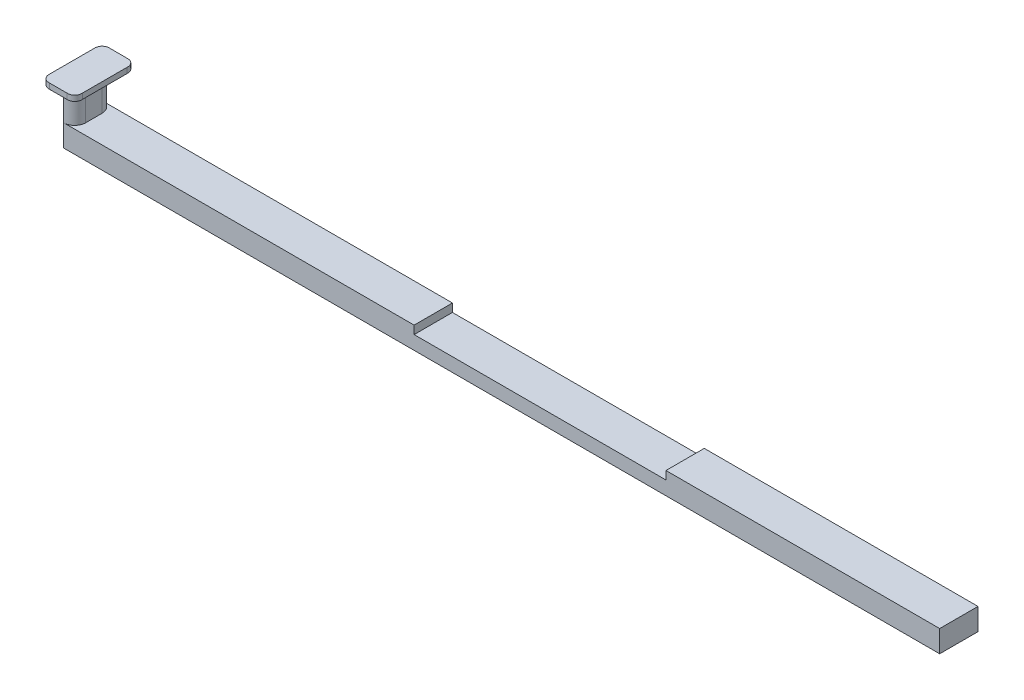
ISO-10303-21;
HEADER;
FILE_DESCRIPTION(('STEP AP214'),'2;1');
FILE_NAME('part.step','',(''),(''),'','','');
FILE_SCHEMA(('AUTOMOTIVE_DESIGN { 1 0 10303 214 1 1 1 1 }'));
ENDSEC;
DATA;
#1=APPLICATION_CONTEXT('core data for automotive mechanical design processes');
#2=APPLICATION_PROTOCOL_DEFINITION('international standard','automotive_design',2000,#1);
#3=PRODUCT_CONTEXT('',#1,'mechanical');
#4=PRODUCT('Part','Part','',(#3));
#5=PRODUCT_RELATED_PRODUCT_CATEGORY('part','',(#4));
#6=PRODUCT_DEFINITION_FORMATION('','',#4);
#7=PRODUCT_DEFINITION_CONTEXT('part definition',#1,'design');
#8=PRODUCT_DEFINITION('design','',#6,#7);
#9=PRODUCT_DEFINITION_SHAPE('','',#8);
#10=(LENGTH_UNIT() NAMED_UNIT(*) SI_UNIT(.MILLI.,.METRE.));
#11=(NAMED_UNIT(*) PLANE_ANGLE_UNIT() SI_UNIT($,.RADIAN.));
#12=(NAMED_UNIT(*) SI_UNIT($,.STERADIAN.) SOLID_ANGLE_UNIT());
#13=UNCERTAINTY_MEASURE_WITH_UNIT(LENGTH_MEASURE(1.E-05),#10,'distance_accuracy_value','');
#14=(GEOMETRIC_REPRESENTATION_CONTEXT(3) GLOBAL_UNCERTAINTY_ASSIGNED_CONTEXT((#13)) GLOBAL_UNIT_ASSIGNED_CONTEXT((#10,
#11,#12)) REPRESENTATION_CONTEXT('',''));
#15=CARTESIAN_POINT('',(0.,0.,0.));
#16=DIRECTION('',(0.,0.,1.));
#17=DIRECTION('',(1.,0.,0.));
#18=AXIS2_PLACEMENT_3D('',#15,#16,#17);
#19=CARTESIAN_POINT('',(-55.,1.,0.));
#20=DIRECTION('',(-1.,0.,0.));
#21=DIRECTION('',(0.,0.,1.));
#22=AXIS2_PLACEMENT_3D('',#19,#20,#21);
#23=PLANE('',#22);
#24=DIRECTION('',(0.,-1.,0.));
#25=VECTOR('',#24,1.);
#26=CARTESIAN_POINT('',(-55.,1.,-3.49999999999999));
#27=LINE('',#26,#25);
#28=CARTESIAN_POINT('',(-55.,4.1894686909815,-3.49999999999999));
#29=VERTEX_POINT('',#28);
#30=CARTESIAN_POINT('',(-55.,2.,-3.5));
#31=VERTEX_POINT('',#30);
#32=EDGE_CURVE('E51',#29,#31,#27,.T.);
#33=ORIENTED_EDGE('',*,*,#32,.T.);
#34=CARTESIAN_POINT('',(-55.,0.,-3.49999999999999));
#35=VERTEX_POINT('',#34);
#36=EDGE_CURVE('E214',#31,#35,#27,.T.);
#37=ORIENTED_EDGE('',*,*,#36,.T.);
#38=DIRECTION('',(0.,0.,-1.));
#39=VECTOR('',#38,1.);
#40=CARTESIAN_POINT('',(-55.,0.,0.));
#41=LINE('',#40,#39);
#42=CARTESIAN_POINT('',(-55.,0.,0.));
#43=VERTEX_POINT('',#42);
#44=EDGE_CURVE('E481',#43,#35,#41,.T.);
#45=ORIENTED_EDGE('',*,*,#44,.F.);
#46=DIRECTION('',(0.,-1.,0.));
#47=VECTOR('',#46,1.);
#48=CARTESIAN_POINT('',(-55.,1.,0.));
#49=LINE('',#48,#47);
#50=CARTESIAN_POINT('',(-55.,2.,0.));
#51=VERTEX_POINT('',#50);
#52=EDGE_CURVE('E474',#51,#43,#49,.T.);
#53=ORIENTED_EDGE('',*,*,#52,.F.);
#54=CARTESIAN_POINT('',(-55.,4.1894686909815,0.));
#55=VERTEX_POINT('',#54);
#56=EDGE_CURVE('E59',#55,#51,#49,.T.);
#57=ORIENTED_EDGE('',*,*,#56,.F.);
#58=CARTESIAN_POINT('',(-55.,5.41421356237309,0.));
#59=DIRECTION('',(-1.,0.,0.));
#60=DIRECTION('',(0.,-0.707106781186546,-0.707106781186549));
#61=AXIS2_PLACEMENT_3D('',#58,#59,#60);
#62=ELLIPSE('',#61,1.73205080756887,1.);
#63=CARTESIAN_POINT('',(-55.,4.,-0.707106781186538));
#64=VERTEX_POINT('',#63);
#65=EDGE_CURVE('E330',#55,#64,#62,.F.);
#66=ORIENTED_EDGE('',*,*,#65,.T.);
#67=DIRECTION('',(0.,0.,1.));
#68=VECTOR('',#67,1.);
#69=CARTESIAN_POINT('',(-55.,4.,0.));
#70=LINE('',#69,#68);
#71=CARTESIAN_POINT('',(-55.,4.,-2.79289321881345));
#72=VERTEX_POINT('',#71);
#73=EDGE_CURVE('E429',#72,#64,#70,.T.);
#74=ORIENTED_EDGE('',*,*,#73,.F.);
#75=CARTESIAN_POINT('',(-55.,5.41421356237309,-3.49999999999999));
#76=DIRECTION('',(-1.,0.,0.));
#77=DIRECTION('',(0.,-0.707106781186546,0.707106781186549));
#78=AXIS2_PLACEMENT_3D('',#75,#76,#77);
#79=ELLIPSE('',#78,1.73205080756887,1.);
#80=EDGE_CURVE('E826',#72,#29,#79,.F.);
#81=ORIENTED_EDGE('',*,*,#80,.T.);
#82=EDGE_LOOP('',(#33,#37,#45,#53,#57,#66,#74,#81));
#83=FACE_BOUND('',#82,.T.);
#84=ADVANCED_FACE('F35',(#83),#23,.T.);
#85=CARTESIAN_POINT('',(0.,1.,0.));
#86=DIRECTION('',(0.,0.,1.));
#87=DIRECTION('',(1.,0.,0.));
#88=AXIS2_PLACEMENT_3D('',#85,#86,#87);
#89=PLANE('',#88);
#90=DIRECTION('',(-1.,0.,0.));
#91=VECTOR('',#90,1.);
#92=CARTESIAN_POINT('',(0.,2.,0.));
#93=LINE('',#92,#91);
#94=CARTESIAN_POINT('',(-23.,2.,0.));
#95=VERTEX_POINT('',#94);
#96=EDGE_CURVE('E198',#95,#51,#93,.T.);
#97=ORIENTED_EDGE('',*,*,#96,.T.);
#98=ORIENTED_EDGE('',*,*,#52,.T.);
#99=DIRECTION('',(-1.,0.,0.));
#100=VECTOR('',#99,1.);
#101=CARTESIAN_POINT('',(0.,0.,0.));
#102=LINE('',#101,#100);
#103=CARTESIAN_POINT('',(25.,0.,0.));
#104=VERTEX_POINT('',#103);
#105=EDGE_CURVE('E478',#104,#43,#102,.T.);
#106=ORIENTED_EDGE('',*,*,#105,.F.);
#107=DIRECTION('',(0.,-1.,0.));
#108=VECTOR('',#107,1.);
#109=CARTESIAN_POINT('',(25.,2.,0.));
#110=LINE('',#109,#108);
#111=CARTESIAN_POINT('',(25.,2.,0.));
#112=VERTEX_POINT('',#111);
#113=EDGE_CURVE('E493',#112,#104,#110,.T.);
#114=ORIENTED_EDGE('',*,*,#113,.F.);
#115=DIRECTION('',(1.,0.,0.));
#116=VECTOR('',#115,1.);
#117=CARTESIAN_POINT('',(0.,2.,0.));
#118=LINE('',#117,#116);
#119=CARTESIAN_POINT('',(0.,2.,0.));
#120=VERTEX_POINT('',#119);
#121=EDGE_CURVE('E508',#120,#112,#118,.T.);
#122=ORIENTED_EDGE('',*,*,#121,.F.);
#123=DIRECTION('',(0.,-1.,0.));
#124=VECTOR('',#123,1.);
#125=CARTESIAN_POINT('',(0.,2.,0.));
#126=LINE('',#125,#124);
#127=CARTESIAN_POINT('',(0.,1.25,0.));
#128=VERTEX_POINT('',#127);
#129=EDGE_CURVE('E501',#120,#128,#126,.T.);
#130=ORIENTED_EDGE('',*,*,#129,.T.);
#131=DIRECTION('',(-1.,0.,0.));
#132=VECTOR('',#131,1.);
#133=CARTESIAN_POINT('',(0.,1.25,0.));
#134=LINE('',#133,#132);
#135=CARTESIAN_POINT('',(-23.,1.25,0.));
#136=VERTEX_POINT('',#135);
#137=EDGE_CURVE('E489',#128,#136,#134,.T.);
#138=ORIENTED_EDGE('',*,*,#137,.T.);
#139=DIRECTION('',(0.,-1.,0.));
#140=VECTOR('',#139,1.);
#141=CARTESIAN_POINT('',(-23.,0.,0.));
#142=LINE('',#141,#140);
#143=EDGE_CURVE('E217',#95,#136,#142,.T.);
#144=ORIENTED_EDGE('',*,*,#143,.F.);
#145=EDGE_LOOP('',(#97,#98,#106,#114,#122,#130,#138,#144));
#146=FACE_BOUND('',#145,.T.);
#147=ADVANCED_FACE('F309',(#146),#89,.T.);
#148=CARTESIAN_POINT('',(0.,1.,-3.49999999999999));
#149=DIRECTION('',(0.,0.,1.));
#150=DIRECTION('',(1.,0.,0.));
#151=AXIS2_PLACEMENT_3D('',#148,#149,#150);
#152=PLANE('',#151);
#153=ORIENTED_EDGE('',*,*,#36,.F.);
#154=DIRECTION('',(-1.,0.,0.));
#155=VECTOR('',#154,1.);
#156=CARTESIAN_POINT('',(0.,2.,-3.5));
#157=LINE('',#156,#155);
#158=CARTESIAN_POINT('',(-23.,2.,-3.5));
#159=VERTEX_POINT('',#158);
#160=EDGE_CURVE('E195',#159,#31,#157,.T.);
#161=ORIENTED_EDGE('',*,*,#160,.F.);
#162=DIRECTION('',(0.,-1.,0.));
#163=VECTOR('',#162,1.);
#164=CARTESIAN_POINT('',(-23.,0.,-3.5));
#165=LINE('',#164,#163);
#166=CARTESIAN_POINT('',(-23.,1.25,-3.5));
#167=VERTEX_POINT('',#166);
#168=EDGE_CURVE('E204',#159,#167,#165,.T.);
#169=ORIENTED_EDGE('',*,*,#168,.T.);
#170=DIRECTION('',(-1.,0.,0.));
#171=VECTOR('',#170,1.);
#172=CARTESIAN_POINT('',(0.,1.25,-3.5));
#173=LINE('',#172,#171);
#174=CARTESIAN_POINT('',(0.,1.25,-3.5));
#175=VERTEX_POINT('',#174);
#176=EDGE_CURVE('E484',#175,#167,#173,.T.);
#177=ORIENTED_EDGE('',*,*,#176,.F.);
#178=DIRECTION('',(0.,-1.,0.));
#179=VECTOR('',#178,1.);
#180=CARTESIAN_POINT('',(0.,2.,-3.5));
#181=LINE('',#180,#179);
#182=CARTESIAN_POINT('',(0.,2.,-3.5));
#183=VERTEX_POINT('',#182);
#184=EDGE_CURVE('E499',#183,#175,#181,.T.);
#185=ORIENTED_EDGE('',*,*,#184,.F.);
#186=DIRECTION('',(1.,0.,0.));
#187=VECTOR('',#186,1.);
#188=CARTESIAN_POINT('',(0.,2.,-3.5));
#189=LINE('',#188,#187);
#190=CARTESIAN_POINT('',(25.,2.,-3.5));
#191=VERTEX_POINT('',#190);
#192=EDGE_CURVE('E512',#183,#191,#189,.T.);
#193=ORIENTED_EDGE('',*,*,#192,.T.);
#194=DIRECTION('',(0.,-1.,0.));
#195=VECTOR('',#194,1.);
#196=CARTESIAN_POINT('',(25.,2.,-3.5));
#197=LINE('',#196,#195);
#198=CARTESIAN_POINT('',(25.,0.,-3.5));
#199=VERTEX_POINT('',#198);
#200=EDGE_CURVE('E496',#191,#199,#197,.T.);
#201=ORIENTED_EDGE('',*,*,#200,.T.);
#202=DIRECTION('',(-1.,0.,0.));
#203=VECTOR('',#202,1.);
#204=CARTESIAN_POINT('',(0.,0.,-3.49999999999999));
#205=LINE('',#204,#203);
#206=EDGE_CURVE('E476',#199,#35,#205,.T.);
#207=ORIENTED_EDGE('',*,*,#206,.T.);
#208=EDGE_LOOP('',(#153,#161,#169,#177,#185,#193,#201,#207));
#209=FACE_BOUND('',#208,.T.);
#210=ADVANCED_FACE('F212',(#209),#152,.F.);
#211=CARTESIAN_POINT('',(0.,0.,0.));
#212=DIRECTION('',(0.,1.,0.));
#213=DIRECTION('',(0.,0.,1.));
#214=AXIS2_PLACEMENT_3D('',#211,#212,#213);
#215=PLANE('',#214);
#216=ORIENTED_EDGE('',*,*,#44,.T.);
#217=ORIENTED_EDGE('',*,*,#206,.F.);
#218=DIRECTION('',(0.,0.,-1.));
#219=VECTOR('',#218,1.);
#220=CARTESIAN_POINT('',(25.,0.,0.));
#221=LINE('',#220,#219);
#222=EDGE_CURVE('E505',#104,#199,#221,.T.);
#223=ORIENTED_EDGE('',*,*,#222,.F.);
#224=ORIENTED_EDGE('',*,*,#105,.T.);
#225=EDGE_LOOP('',(#216,#217,#223,#224));
#226=FACE_BOUND('',#225,.T.);
#227=ADVANCED_FACE('F302',(#226),#215,.F.);
#228=CARTESIAN_POINT('',(0.,1.25,0.));
#229=DIRECTION('',(0.,1.,0.));
#230=DIRECTION('',(0.,0.,1.));
#231=AXIS2_PLACEMENT_3D('',#228,#229,#230);
#232=PLANE('',#231);
#233=DIRECTION('',(0.,0.,-1.));
#234=VECTOR('',#233,1.);
#235=CARTESIAN_POINT('',(-23.,1.25,0.));
#236=LINE('',#235,#234);
#237=EDGE_CURVE('E207',#136,#167,#236,.T.);
#238=ORIENTED_EDGE('',*,*,#237,.F.);
#239=ORIENTED_EDGE('',*,*,#137,.F.);
#240=DIRECTION('',(0.,0.,-1.));
#241=VECTOR('',#240,1.);
#242=CARTESIAN_POINT('',(0.,1.25,0.));
#243=LINE('',#242,#241);
#244=EDGE_CURVE('E486',#128,#175,#243,.T.);
#245=ORIENTED_EDGE('',*,*,#244,.T.);
#246=ORIENTED_EDGE('',*,*,#176,.T.);
#247=EDGE_LOOP('',(#238,#239,#245,#246));
#248=FACE_BOUND('',#247,.T.);
#249=ADVANCED_FACE('F295',(#248),#232,.T.);
#250=CARTESIAN_POINT('',(0.,2.,0.));
#251=DIRECTION('',(-1.,0.,0.));
#252=DIRECTION('',(0.,0.,1.));
#253=AXIS2_PLACEMENT_3D('',#250,#251,#252);
#254=PLANE('',#253);
#255=ORIENTED_EDGE('',*,*,#244,.F.);
#256=ORIENTED_EDGE('',*,*,#129,.F.);
#257=DIRECTION('',(0.,0.,-1.));
#258=VECTOR('',#257,1.);
#259=CARTESIAN_POINT('',(0.,2.,0.));
#260=LINE('',#259,#258);
#261=EDGE_CURVE('E504',#120,#183,#260,.T.);
#262=ORIENTED_EDGE('',*,*,#261,.T.);
#263=ORIENTED_EDGE('',*,*,#184,.T.);
#264=EDGE_LOOP('',(#255,#256,#262,#263));
#265=FACE_BOUND('',#264,.T.);
#266=ADVANCED_FACE('F292',(#265),#254,.T.);
#267=CARTESIAN_POINT('',(25.,2.,0.));
#268=DIRECTION('',(-1.,0.,0.));
#269=DIRECTION('',(0.,0.,1.));
#270=AXIS2_PLACEMENT_3D('',#267,#268,#269);
#271=PLANE('',#270);
#272=ORIENTED_EDGE('',*,*,#222,.T.);
#273=ORIENTED_EDGE('',*,*,#200,.F.);
#274=DIRECTION('',(0.,0.,-1.));
#275=VECTOR('',#274,1.);
#276=CARTESIAN_POINT('',(25.,2.,0.));
#277=LINE('',#276,#275);
#278=EDGE_CURVE('E515',#112,#191,#277,.T.);
#279=ORIENTED_EDGE('',*,*,#278,.F.);
#280=ORIENTED_EDGE('',*,*,#113,.T.);
#281=EDGE_LOOP('',(#272,#273,#279,#280));
#282=FACE_BOUND('',#281,.T.);
#283=ADVANCED_FACE('F290',(#282),#271,.F.);
#284=CARTESIAN_POINT('',(0.,2.,0.));
#285=DIRECTION('',(0.,1.,0.));
#286=DIRECTION('',(0.,0.,1.));
#287=AXIS2_PLACEMENT_3D('',#284,#285,#286);
#288=PLANE('',#287);
#289=ORIENTED_EDGE('',*,*,#121,.T.);
#290=ORIENTED_EDGE('',*,*,#278,.T.);
#291=ORIENTED_EDGE('',*,*,#192,.F.);
#292=ORIENTED_EDGE('',*,*,#261,.F.);
#293=EDGE_LOOP('',(#289,#290,#291,#292));
#294=FACE_BOUND('',#293,.T.);
#295=ADVANCED_FACE('F286',(#294),#288,.T.);
#296=CARTESIAN_POINT('',(-54.,4.,0.));
#297=DIRECTION('',(-1.,0.,0.));
#298=DIRECTION('',(0.,0.,1.));
#299=AXIS2_PLACEMENT_3D('',#296,#297,#298);
#300=PLANE('',#299);
#301=DIRECTION('',(0.,-1.,0.));
#302=VECTOR('',#301,1.);
#303=CARTESIAN_POINT('',(-54.,1.,-0.999999999999993));
#304=LINE('',#303,#302);
#305=CARTESIAN_POINT('',(-54.,4.,-0.999999999999993));
#306=VERTEX_POINT('',#305);
#307=CARTESIAN_POINT('',(-54.,2.,-0.999999999999993));
#308=VERTEX_POINT('',#307);
#309=EDGE_CURVE('E424',#306,#308,#304,.T.);
#310=ORIENTED_EDGE('',*,*,#309,.T.);
#311=DIRECTION('',(0.,0.,-1.));
#312=VECTOR('',#311,1.);
#313=CARTESIAN_POINT('',(-54.,2.,0.));
#314=LINE('',#313,#312);
#315=CARTESIAN_POINT('',(-54.,2.,-2.49999999999999));
#316=VERTEX_POINT('',#315);
#317=EDGE_CURVE('E201',#308,#316,#314,.T.);
#318=ORIENTED_EDGE('',*,*,#317,.T.);
#319=DIRECTION('',(0.,-1.,0.));
#320=VECTOR('',#319,1.);
#321=CARTESIAN_POINT('',(-54.,4.,-2.49999999999999));
#322=LINE('',#321,#320);
#323=CARTESIAN_POINT('',(-54.,4.,-2.49999999999999));
#324=VERTEX_POINT('',#323);
#325=EDGE_CURVE('E471',#316,#324,#322,.F.);
#326=ORIENTED_EDGE('',*,*,#325,.T.);
#327=DIRECTION('',(0.,0.,-1.));
#328=VECTOR('',#327,1.);
#329=CARTESIAN_POINT('',(-54.,4.,0.));
#330=LINE('',#329,#328);
#331=EDGE_CURVE('E509',#306,#324,#330,.T.);
#332=ORIENTED_EDGE('',*,*,#331,.F.);
#333=EDGE_LOOP('',(#310,#318,#326,#332));
#334=FACE_BOUND('',#333,.T.);
#335=ADVANCED_FACE('F270',(#334),#300,.F.);
#336=CARTESIAN_POINT('',(-55.,4.,0.));
#337=DIRECTION('',(-0.707106781186546,-0.707106781186549,0.));
#338=DIRECTION('',(0.707106781186549,-0.707106781186546,0.));
#339=AXIS2_PLACEMENT_3D('',#336,#337,#338);
#340=PLANE('',#339);
#341=ORIENTED_EDGE('',*,*,#73,.T.);
#342=DIRECTION('',(-0.577350269189627,0.577350269189624,0.577350269189627));
#343=VECTOR('',#342,1.);
#344=CARTESIAN_POINT('',(-55.2357022603955,4.23570226039551,-0.471404520791022));
#345=LINE('',#344,#343);
#346=CARTESIAN_POINT('',(-56.,5.,0.292893218813468));
#347=VERTEX_POINT('',#346);
#348=EDGE_CURVE('E349',#64,#347,#345,.T.);
#349=ORIENTED_EDGE('',*,*,#348,.T.);
#350=DIRECTION('',(0.,0.,-1.));
#351=VECTOR('',#350,1.);
#352=CARTESIAN_POINT('',(-56.,5.,0.));
#353=LINE('',#352,#351);
#354=CARTESIAN_POINT('',(-56.,5.,-3.79289321881345));
#355=VERTEX_POINT('',#354);
#356=EDGE_CURVE('E360',#355,#347,#353,.F.);
#357=ORIENTED_EDGE('',*,*,#356,.F.);
#358=DIRECTION('',(-0.577350269189627,0.577350269189624,-0.577350269189627));
#359=VECTOR('',#358,1.);
#360=CARTESIAN_POINT('',(-54.0690355937288,3.06903559372885,-1.86192881254229));
#361=LINE('',#360,#359);
#362=EDGE_CURVE('E357',#355,#72,#361,.F.);
#363=ORIENTED_EDGE('',*,*,#362,.T.);
#364=EDGE_LOOP('',(#341,#349,#357,#363));
#365=FACE_BOUND('',#364,.T.);
#366=ADVANCED_FACE('F266',(#365),#340,.T.);
#367=CARTESIAN_POINT('',(-55.,4.,0.));
#368=DIRECTION('',(0.,-0.707106781186549,0.707106781186546));
#369=DIRECTION('',(0.,-0.707106781186546,-0.707106781186549));
#370=AXIS2_PLACEMENT_3D('',#367,#368,#369);
#371=PLANE('',#370);
#372=DIRECTION('',(-1.,0.,0.));
#373=VECTOR('',#372,1.);
#374=CARTESIAN_POINT('',(0.,5.,1.00000000000001));
#375=LINE('',#374,#373);
#376=CARTESIAN_POINT('',(-55.2928932188135,5.,1.00000000000001));
#377=VERTEX_POINT('',#376);
#378=CARTESIAN_POINT('',(-53.7071067811865,5.,1.00000000000001));
#379=VERTEX_POINT('',#378);
#380=EDGE_CURVE('E363',#377,#379,#375,.F.);
#381=ORIENTED_EDGE('',*,*,#380,.F.);
#382=DIRECTION('',(-0.577350269189627,0.577350269189624,0.577350269189627));
#383=VECTOR('',#382,1.);
#384=CARTESIAN_POINT('',(-54.528595479209,4.23570226039551,0.235702260395523));
#385=LINE('',#384,#383);
#386=CARTESIAN_POINT('',(-54.5,4.20710678118655,0.207106781186555));
#387=VERTEX_POINT('',#386);
#388=EDGE_CURVE('E372',#377,#387,#385,.F.);
#389=ORIENTED_EDGE('',*,*,#388,.T.);
#390=DIRECTION('',(0.577350269189627,0.577350269189624,0.577350269189627));
#391=VECTOR('',#390,1.);
#392=CARTESIAN_POINT('',(-54.8047378541244,3.90236892706218,-0.0976310729378112));
#393=LINE('',#392,#391);
#394=EDGE_CURVE('E389',#387,#379,#393,.T.);
#395=ORIENTED_EDGE('',*,*,#394,.T.);
#396=EDGE_LOOP('',(#381,#389,#395));
#397=FACE_BOUND('',#396,.T.);
#398=ADVANCED_FACE('F269',(#397),#371,.T.);
#399=CARTESIAN_POINT('',(-54.,4.,0.));
#400=DIRECTION('',(0.707106781186546,-0.707106781186549,0.));
#401=DIRECTION('',(0.707106781186549,0.707106781186546,0.));
#402=AXIS2_PLACEMENT_3D('',#399,#400,#401);
#403=PLANE('',#402);
#404=DIRECTION('',(0.,0.,1.));
#405=VECTOR('',#404,1.);
#406=CARTESIAN_POINT('',(-53.,5.,0.));
#407=LINE('',#406,#405);
#408=CARTESIAN_POINT('',(-53.,5.,0.292893218813469));
#409=VERTEX_POINT('',#408);
#410=CARTESIAN_POINT('',(-53.,5.,-3.79289321881345));
#411=VERTEX_POINT('',#410);
#412=EDGE_CURVE('E369',#409,#411,#407,.F.);
#413=ORIENTED_EDGE('',*,*,#412,.F.);
#414=DIRECTION('',(0.577350269189627,0.577350269189624,0.577350269189627));
#415=VECTOR('',#414,1.);
#416=CARTESIAN_POINT('',(-53.7642977396045,4.23570226039552,-0.471404520791024));
#417=LINE('',#416,#415);
#418=CARTESIAN_POINT('',(-54.0340741737109,3.96592582628907,-0.741180954897473));
#419=VERTEX_POINT('',#418);
#420=EDGE_CURVE('E397',#409,#419,#417,.F.);
#421=ORIENTED_EDGE('',*,*,#420,.T.);
#422=CARTESIAN_POINT('',(-55.,3.,-0.999999999999993));
#423=DIRECTION('',(0.707106781186546,-0.707106781186549,0.));
#424=DIRECTION('',(0.707106781186549,0.707106781186546,0.));
#425=AXIS2_PLACEMENT_3D('',#422,#423,#424);
#426=ELLIPSE('',#425,1.41421356237309,1.);
#427=EDGE_CURVE('E435',#419,#306,#426,.F.);
#428=ORIENTED_EDGE('',*,*,#427,.T.);
#429=ORIENTED_EDGE('',*,*,#331,.T.);
#430=CARTESIAN_POINT('',(-55.,3.,-2.49999999999999));
#431=DIRECTION('',(0.707106781186546,-0.707106781186549,0.));
#432=DIRECTION('',(-0.707106781186549,-0.707106781186546,0.));
#433=AXIS2_PLACEMENT_3D('',#430,#431,#432);
#434=ELLIPSE('',#433,1.41421356237309,1.);
#435=CARTESIAN_POINT('',(-54.0340741737109,3.96592582628907,-2.75881904510251));
#436=VERTEX_POINT('',#435);
#437=EDGE_CURVE('E376',#324,#436,#434,.F.);
#438=ORIENTED_EDGE('',*,*,#437,.T.);
#439=DIRECTION('',(0.577350269189627,0.577350269189624,-0.577350269189627));
#440=VECTOR('',#439,1.);
#441=CARTESIAN_POINT('',(-54.9309644062712,3.06903559372885,-1.86192881254229));
#442=LINE('',#441,#440);
#443=EDGE_CURVE('E406',#436,#411,#442,.T.);
#444=ORIENTED_EDGE('',*,*,#443,.T.);
#445=EDGE_LOOP('',(#413,#421,#428,#429,#438,#444));
#446=FACE_BOUND('',#445,.T.);
#447=ADVANCED_FACE('F276',(#446),#403,.T.);
#448=CARTESIAN_POINT('',(-55.,4.,-3.49999999999999));
#449=DIRECTION('',(0.,-0.707106781186549,-0.707106781186546));
#450=DIRECTION('',(0.,0.707106781186546,-0.707106781186549));
#451=AXIS2_PLACEMENT_3D('',#448,#449,#450);
#452=PLANE('',#451);
#453=DIRECTION('',(0.577350269189627,0.577350269189624,-0.577350269189627));
#454=VECTOR('',#453,1.);
#455=CARTESIAN_POINT('',(-54.8047378541244,3.90236892706218,-3.40236892706218));
#456=LINE('',#455,#454);
#457=CARTESIAN_POINT('',(-53.7071067811865,5.,-4.5));
#458=VERTEX_POINT('',#457);
#459=CARTESIAN_POINT('',(-54.5,4.20710678118654,-3.70710678118654));
#460=VERTEX_POINT('',#459);
#461=EDGE_CURVE('E432',#458,#460,#456,.F.);
#462=ORIENTED_EDGE('',*,*,#461,.T.);
#463=DIRECTION('',(-0.577350269189627,0.577350269189624,-0.577350269189627));
#464=VECTOR('',#463,1.);
#465=CARTESIAN_POINT('',(-54.528595479209,4.23570226039552,-3.73570226039551));
#466=LINE('',#465,#464);
#467=CARTESIAN_POINT('',(-55.2928932188135,5.,-4.5));
#468=VERTEX_POINT('',#467);
#469=EDGE_CURVE('E331',#460,#468,#466,.T.);
#470=ORIENTED_EDGE('',*,*,#469,.T.);
#471=DIRECTION('',(1.,0.,0.));
#472=VECTOR('',#471,1.);
#473=CARTESIAN_POINT('',(0.,5.,-4.5));
#474=LINE('',#473,#472);
#475=EDGE_CURVE('E402',#458,#468,#474,.F.);
#476=ORIENTED_EDGE('',*,*,#475,.F.);
#477=EDGE_LOOP('',(#462,#470,#476));
#478=FACE_BOUND('',#477,.T.);
#479=ADVANCED_FACE('F272',(#478),#452,.T.);
#480=CARTESIAN_POINT('',(-54.471404520791,4.94280904158206,-0.471404520791024));
#481=DIRECTION('',(-0.577350269189627,-0.577350269189624,-0.577350269189627));
#482=DIRECTION('',(-0.707106781186547,0.,0.707106781186547));
#483=AXIS2_PLACEMENT_3D('',#480,#481,#482);
#484=CYLINDRICAL_SURFACE('',#483,1.);
#485=ORIENTED_EDGE('',*,*,#394,.F.);
#486=CARTESIAN_POINT('',(-54.5,4.91421356237309,-0.499999999999994));
#487=DIRECTION('',(-1.,0.,0.));
#488=DIRECTION('',(0.,-0.707106781186546,-0.707106781186549));
#489=AXIS2_PLACEMENT_3D('',#486,#487,#488);
#490=ELLIPSE('',#489,1.73205080756887,1.);
#491=CARTESIAN_POINT('',(-54.5,3.91421356237309,-0.133974596215555));
#492=VERTEX_POINT('',#491);
#493=EDGE_CURVE('E375',#387,#492,#490,.F.);
#494=ORIENTED_EDGE('',*,*,#493,.T.);
#495=CARTESIAN_POINT('',(-55.,4.41421356237309,-0.999999999999994));
#496=DIRECTION('',(0.325057583671869,0.888073833977115,0.325057583671869));
#497=DIRECTION('',(-0.627963030199554,0.459700843380984,-0.627963030199554));
#498=AXIS2_PLACEMENT_3D('',#495,#496,#497);
#499=ELLIPSE('',#498,1.12603250061049,1.);
#500=EDGE_CURVE('E364',#419,#492,#499,.F.);
#501=ORIENTED_EDGE('',*,*,#500,.F.);
#502=ORIENTED_EDGE('',*,*,#420,.F.);
#503=CARTESIAN_POINT('',(-53.6524168464264,5.,0.347583153573566));
#504=DIRECTION('',(0.,1.,0.));
#505=DIRECTION('',(-0.0835336965489974,0.,0.996504953093992));
#506=AXIS2_PLACEMENT_3D('',#503,#504,#505);
#507=CIRCLE('',#506,0.654705071360446);
#508=EDGE_CURVE('E385',#379,#409,#507,.T.);
#509=ORIENTED_EDGE('',*,*,#508,.F.);
#510=EDGE_LOOP('',(#485,#494,#501,#502,#509));
#511=FACE_BOUND('',#510,.T.);
#512=ADVANCED_FACE('F275',(#511),#484,.T.);
#513=CARTESIAN_POINT('',(-55.,4.,-0.999999999999993));
#514=DIRECTION('',(0.,1.,0.));
#515=DIRECTION('',(0.,0.,1.));
#516=AXIS2_PLACEMENT_3D('',#513,#514,#515);
#517=CYLINDRICAL_SURFACE('',#516,1.);
#518=CARTESIAN_POINT('',(-55.,2.,-0.999999999999993));
#519=DIRECTION('',(0.,1.,0.));
#520=DIRECTION('',(-1.,0.,0.));
#521=AXIS2_PLACEMENT_3D('',#518,#519,#520);
#522=CIRCLE('',#521,1.);
#523=EDGE_CURVE('E222',#308,#51,#522,.F.);
#524=ORIENTED_EDGE('',*,*,#523,.F.);
#525=ORIENTED_EDGE('',*,*,#309,.F.);
#526=ORIENTED_EDGE('',*,*,#427,.F.);
#527=ORIENTED_EDGE('',*,*,#500,.T.);
#528=CARTESIAN_POINT('',(-54.5,3.91421356237309,-0.133974596215555));
#529=CARTESIAN_POINT('',(-54.5266151248421,3.93261761021214,-0.118595916916454));
#530=CARTESIAN_POINT('',(-54.5541879398347,3.95056681233239,-0.104325525532397));
#531=CARTESIAN_POINT('',(-54.6109652356036,3.98568369920809,-0.0782502599266823));
#532=CARTESIAN_POINT('',(-54.6401703008595,4.00285109996909,-0.0664462761440814));
#533=CARTESIAN_POINT('',(-54.6993274998772,4.03619186387759,-0.0457674074255712));
#534=CARTESIAN_POINT('',(-54.7292540347567,4.05237807005701,-0.0368399907008242));
#535=CARTESIAN_POINT('',(-54.7900149808422,4.0843056764526,-0.0217950970654349));
#536=CARTESIAN_POINT('',(-54.820848851545,4.10004733095882,-0.0156759819069787));
#537=CARTESIAN_POINT('',(-54.8763345750286,4.12796609663996,-0.00736973846450271));
#538=CARTESIAN_POINT('',(-54.9008853476069,4.14017969867852,-0.00461919069330411));
#539=CARTESIAN_POINT('',(-54.9503027446918,4.16472413076465,-0.000924720046985732));
#540=CARTESIAN_POINT('',(-54.9751703421301,4.17705513537143,5.02658163596485E-06));
#541=CARTESIAN_POINT('',(-55.,4.1894686909815,0.));
#542=B_SPLINE_CURVE_WITH_KNOTS('',3,(#528,#529,#530,#531,#532,#533,#534,#535,#536,#537,#538,
#539,#540,#541),.UNSPECIFIED.,.F.,.F.,(4,2,2,2,2,2,4),(0.,0.107452928556526,0.214944583717794,
0.320344381857322,0.425682615682585,0.508300136825396,0.591558377056568),.UNSPECIFIED.);
#543=EDGE_CURVE('E324',#492,#55,#542,.T.);
#544=ORIENTED_EDGE('',*,*,#543,.T.);
#545=ORIENTED_EDGE('',*,*,#56,.T.);
#546=EDGE_LOOP('',(#524,#525,#526,#527,#544,#545));
#547=FACE_BOUND('',#546,.T.);
#548=ADVANCED_FACE('F315',(#547),#517,.T.);
#549=CARTESIAN_POINT('',(-54.8047378541244,4.60947570824873,-2.69526214587563));
#550=DIRECTION('',(-0.577350269189627,-0.577350269189624,0.577350269189627));
#551=DIRECTION('',(0.707106781186547,0.,0.707106781186547));
#552=AXIS2_PLACEMENT_3D('',#549,#550,#551);
#553=CYLINDRICAL_SURFACE('',#552,1.);
#554=CARTESIAN_POINT('',(-55.,4.41421356237309,-2.49999999999999));
#555=DIRECTION('',(-0.325057583671869,-0.888073833977115,0.325057583671869));
#556=DIRECTION('',(0.627963030199554,-0.459700843380984,-0.627963030199554));
#557=AXIS2_PLACEMENT_3D('',#554,#555,#556);
#558=ELLIPSE('',#557,1.12603250061049,1.);
#559=CARTESIAN_POINT('',(-54.5,3.91421356237309,-3.36602540378443));
#560=VERTEX_POINT('',#559);
#561=EDGE_CURVE('E462',#560,#436,#558,.T.);
#562=ORIENTED_EDGE('',*,*,#561,.F.);
#563=CARTESIAN_POINT('',(-54.5,4.91421356237309,-2.99999999999999));
#564=DIRECTION('',(-1.,0.,0.));
#565=DIRECTION('',(0.,-0.707106781186546,0.707106781186549));
#566=AXIS2_PLACEMENT_3D('',#563,#564,#565);
#567=ELLIPSE('',#566,1.73205080756887,1.);
#568=EDGE_CURVE('E332',#560,#460,#567,.F.);
#569=ORIENTED_EDGE('',*,*,#568,.T.);
#570=ORIENTED_EDGE('',*,*,#461,.F.);
#571=CARTESIAN_POINT('',(-53.6524168464264,5.,-3.84758315357355));
#572=DIRECTION('',(0.,1.,0.));
#573=DIRECTION('',(0.996504953093994,0.,0.0835336965489772));
#574=AXIS2_PLACEMENT_3D('',#571,#572,#573);
#575=CIRCLE('',#574,0.654705071360444);
#576=EDGE_CURVE('E396',#411,#458,#575,.T.);
#577=ORIENTED_EDGE('',*,*,#576,.F.);
#578=ORIENTED_EDGE('',*,*,#443,.F.);
#579=EDGE_LOOP('',(#562,#569,#570,#577,#578));
#580=FACE_BOUND('',#579,.T.);
#581=ADVANCED_FACE('F319',(#580),#553,.T.);
#582=CARTESIAN_POINT('',(-55.,1.,-2.49999999999999));
#583=DIRECTION('',(0.,-1.,0.));
#584=DIRECTION('',(0.,0.,-1.));
#585=AXIS2_PLACEMENT_3D('',#582,#583,#584);
#586=CYLINDRICAL_SURFACE('',#585,1.);
#587=CARTESIAN_POINT('',(-55.,2.,-2.49999999999999));
#588=DIRECTION('',(0.,1.,0.));
#589=DIRECTION('',(-1.,0.,0.));
#590=AXIS2_PLACEMENT_3D('',#587,#588,#589);
#591=CIRCLE('',#590,1.);
#592=EDGE_CURVE('E11',#31,#316,#591,.F.);
#593=ORIENTED_EDGE('',*,*,#592,.F.);
#594=ORIENTED_EDGE('',*,*,#32,.F.);
#595=CARTESIAN_POINT('',(-55.,4.1894686909815,-3.49999999999999));
#596=CARTESIAN_POINT('',(-54.9679883482582,4.17346844035996,-3.50001528039358));
#597=CARTESIAN_POINT('',(-54.9359131548531,4.15759911701809,-3.49846361034555));
#598=CARTESIAN_POINT('',(-54.872062821026,4.12582663949543,-3.49229673916484));
#599=CARTESIAN_POINT('',(-54.8402877753644,4.10992347645281,-3.48768060130469));
#600=CARTESIAN_POINT('',(-54.7780951395444,4.0781091845052,-3.47557401581599));
#601=CARTESIAN_POINT('',(-54.7476631698055,4.06220421468082,-3.46814116099617));
#602=CARTESIAN_POINT('',(-54.6879045739335,4.02986717549067,-3.45056054323611));
#603=CARTESIAN_POINT('',(-54.6585773250501,4.01343541305916,-3.44041433680132));
#604=CARTESIAN_POINT('',(-54.6074188719602,3.98343455146863,-3.42003750703664));
#605=CARTESIAN_POINT('',(-54.5853183638167,3.96999854983967,-3.4102823644588));
#606=CARTESIAN_POINT('',(-54.5419502130469,3.94253835799589,-3.3892564429768));
#607=CARTESIAN_POINT('',(-54.5206903594406,3.92851041408971,-3.37797449580068));
#608=CARTESIAN_POINT('',(-54.5,3.91421356237309,-3.36602540378443));
#609=B_SPLINE_CURVE_WITH_KNOTS('',3,(#595,#596,#597,#598,#599,#600,#601,#602,#603,#604,#605,
#606,#607,#608),.UNSPECIFIED.,.F.,.F.,(4,2,2,2,2,2,4),(0.,0.107327039254094,0.214686900686109,
0.319960680451734,0.425174199312487,0.508044746613777,0.591558027095634),.UNSPECIFIED.);
#610=EDGE_CURVE('E44',#29,#560,#609,.T.);
#611=ORIENTED_EDGE('',*,*,#610,.T.);
#612=ORIENTED_EDGE('',*,*,#561,.T.);
#613=ORIENTED_EDGE('',*,*,#437,.F.);
#614=ORIENTED_EDGE('',*,*,#325,.F.);
#615=EDGE_LOOP('',(#593,#594,#611,#612,#613,#614));
#616=FACE_BOUND('',#615,.T.);
#617=ADVANCED_FACE('F339',(#616),#586,.T.);
#618=CARTESIAN_POINT('',(-54.528595479209,4.94280904158206,-0.471404520791024));
#619=DIRECTION('',(0.577350269189627,-0.577350269189624,-0.577350269189627));
#620=DIRECTION('',(-0.707106781186547,0.,-0.707106781186547));
#621=AXIS2_PLACEMENT_3D('',#618,#619,#620);
#622=CYLINDRICAL_SURFACE('',#621,1.);
#623=CARTESIAN_POINT('',(-55.3475831535736,5.,0.347583153573568));
#624=DIRECTION('',(0.,1.,0.));
#625=DIRECTION('',(-0.996504953093994,0.,-0.0835336965489774));
#626=AXIS2_PLACEMENT_3D('',#623,#624,#625);
#627=CIRCLE('',#626,0.654705071360444);
#628=EDGE_CURVE('E248',#347,#377,#627,.T.);
#629=ORIENTED_EDGE('',*,*,#628,.F.);
#630=ORIENTED_EDGE('',*,*,#348,.F.);
#631=ORIENTED_EDGE('',*,*,#65,.F.);
#632=ORIENTED_EDGE('',*,*,#543,.F.);
#633=ORIENTED_EDGE('',*,*,#493,.F.);
#634=ORIENTED_EDGE('',*,*,#388,.F.);
#635=EDGE_LOOP('',(#629,#630,#631,#632,#633,#634));
#636=FACE_BOUND('',#635,.T.);
#637=ADVANCED_FACE('F335',(#636),#622,.T.);
#638=CARTESIAN_POINT('',(-53.3619288125423,3.7761423749154,-1.86192881254229));
#639=DIRECTION('',(0.577350269189627,-0.577350269189624,0.577350269189627));
#640=DIRECTION('',(0.707106781186547,0.,-0.707106781186547));
#641=AXIS2_PLACEMENT_3D('',#638,#639,#640);
#642=CYLINDRICAL_SURFACE('',#641,1.);
#643=CARTESIAN_POINT('',(-55.3475831535736,5.,-3.84758315357355));
#644=DIRECTION('',(0.,1.,0.));
#645=DIRECTION('',(0.0835336965489974,0.,-0.996504953093992));
#646=AXIS2_PLACEMENT_3D('',#643,#644,#645);
#647=CIRCLE('',#646,0.654705071360446);
#648=EDGE_CURVE('E356',#468,#355,#647,.T.);
#649=ORIENTED_EDGE('',*,*,#648,.F.);
#650=ORIENTED_EDGE('',*,*,#469,.F.);
#651=ORIENTED_EDGE('',*,*,#568,.F.);
#652=ORIENTED_EDGE('',*,*,#610,.F.);
#653=ORIENTED_EDGE('',*,*,#80,.F.);
#654=ORIENTED_EDGE('',*,*,#362,.F.);
#655=EDGE_LOOP('',(#649,#650,#651,#652,#653,#654));
#656=FACE_BOUND('',#655,.T.);
#657=ADVANCED_FACE('F37',(#656),#642,.T.);
#658=CARTESIAN_POINT('',(-55.3475831535736,5.5,0.347583153573568));
#659=DIRECTION('',(0.,-1.,0.));
#660=DIRECTION('',(0.,0.,-1.));
#661=AXIS2_PLACEMENT_3D('',#658,#659,#660);
#662=CYLINDRICAL_SURFACE('',#661,0.654705071360446);
#663=ORIENTED_EDGE('',*,*,#628,.T.);
#664=DIRECTION('',(0.,-1.,0.));
#665=VECTOR('',#664,1.);
#666=CARTESIAN_POINT('',(-55.2928932188135,5.5,1.00000000000001));
#667=LINE('',#666,#665);
#668=CARTESIAN_POINT('',(-55.2928932188135,5.5,1.00000000000001));
#669=VERTEX_POINT('',#668);
#670=EDGE_CURVE('E464',#669,#377,#667,.T.);
#671=ORIENTED_EDGE('',*,*,#670,.F.);
#672=CARTESIAN_POINT('',(-55.3475831535736,5.5,0.347583153573568));
#673=DIRECTION('',(0.,1.,0.));
#674=DIRECTION('',(0.,0.,-1.));
#675=AXIS2_PLACEMENT_3D('',#672,#673,#674);
#676=CIRCLE('',#675,0.654705071360446);
#677=CARTESIAN_POINT('',(-56.,5.5,0.292893218813468));
#678=VERTEX_POINT('',#677);
#679=EDGE_CURVE('E224',#678,#669,#676,.T.);
#680=ORIENTED_EDGE('',*,*,#679,.F.);
#681=DIRECTION('',(0.,-1.,0.));
#682=VECTOR('',#681,1.);
#683=CARTESIAN_POINT('',(-56.,5.5,0.292893218813468));
#684=LINE('',#683,#682);
#685=EDGE_CURVE('E241',#678,#347,#684,.T.);
#686=ORIENTED_EDGE('',*,*,#685,.T.);
#687=EDGE_LOOP('',(#663,#671,#680,#686));
#688=FACE_BOUND('',#687,.T.);
#689=ADVANCED_FACE('F254',(#688),#662,.T.);
#690=CARTESIAN_POINT('',(-55.2928932188135,5.5,1.00000000000001));
#691=DIRECTION('',(0.,0.,-1.));
#692=DIRECTION('',(-1.,0.,0.));
#693=AXIS2_PLACEMENT_3D('',#690,#691,#692);
#694=PLANE('',#693);
#695=ORIENTED_EDGE('',*,*,#380,.T.);
#696=DIRECTION('',(0.,-1.,0.));
#697=VECTOR('',#696,1.);
#698=CARTESIAN_POINT('',(-53.7071067811865,5.5,1.00000000000001));
#699=LINE('',#698,#697);
#700=CARTESIAN_POINT('',(-53.7071067811865,5.5,1.00000000000001));
#701=VERTEX_POINT('',#700);
#702=EDGE_CURVE('E594',#701,#379,#699,.T.);
#703=ORIENTED_EDGE('',*,*,#702,.F.);
#704=DIRECTION('',(1.,0.,0.));
#705=VECTOR('',#704,1.);
#706=CARTESIAN_POINT('',(-55.2928932188135,5.5,1.00000000000001));
#707=LINE('',#706,#705);
#708=EDGE_CURVE('E227',#669,#701,#707,.T.);
#709=ORIENTED_EDGE('',*,*,#708,.F.);
#710=ORIENTED_EDGE('',*,*,#670,.T.);
#711=EDGE_LOOP('',(#695,#703,#709,#710));
#712=FACE_BOUND('',#711,.T.);
#713=ADVANCED_FACE('F264',(#712),#694,.F.);
#714=CARTESIAN_POINT('',(-53.6524168464264,5.5,0.347583153573566));
#715=DIRECTION('',(0.,-1.,0.));
#716=DIRECTION('',(0.,0.,-1.));
#717=AXIS2_PLACEMENT_3D('',#714,#715,#716);
#718=CYLINDRICAL_SURFACE('',#717,0.654705071360446);
#719=ORIENTED_EDGE('',*,*,#508,.T.);
#720=DIRECTION('',(0.,-1.,0.));
#721=VECTOR('',#720,1.);
#722=CARTESIAN_POINT('',(-53.,5.5,0.292893218813466));
#723=LINE('',#722,#721);
#724=CARTESIAN_POINT('',(-53.,5.5,0.292893218813466));
#725=VERTEX_POINT('',#724);
#726=EDGE_CURVE('E575',#725,#409,#723,.T.);
#727=ORIENTED_EDGE('',*,*,#726,.F.);
#728=CARTESIAN_POINT('',(-53.6524168464264,5.5,0.347583153573566));
#729=DIRECTION('',(0.,1.,0.));
#730=DIRECTION('',(0.,0.,1.));
#731=AXIS2_PLACEMENT_3D('',#728,#729,#730);
#732=CIRCLE('',#731,0.654705071360446);
#733=EDGE_CURVE('E229',#701,#725,#732,.T.);
#734=ORIENTED_EDGE('',*,*,#733,.F.);
#735=ORIENTED_EDGE('',*,*,#702,.T.);
#736=EDGE_LOOP('',(#719,#727,#734,#735));
#737=FACE_BOUND('',#736,.T.);
#738=ADVANCED_FACE('F590',(#737),#718,.T.);
#739=CARTESIAN_POINT('',(-53.,5.5,0.292893218813466));
#740=DIRECTION('',(-1.,0.,0.));
#741=DIRECTION('',(0.,0.,1.));
#742=AXIS2_PLACEMENT_3D('',#739,#740,#741);
#743=PLANE('',#742);
#744=ORIENTED_EDGE('',*,*,#412,.T.);
#745=DIRECTION('',(0.,-1.,0.));
#746=VECTOR('',#745,1.);
#747=CARTESIAN_POINT('',(-53.,5.5,-3.79289321881345));
#748=LINE('',#747,#746);
#749=CARTESIAN_POINT('',(-53.,5.5,-3.79289321881345));
#750=VERTEX_POINT('',#749);
#751=EDGE_CURVE('E567',#750,#411,#748,.T.);
#752=ORIENTED_EDGE('',*,*,#751,.F.);
#753=DIRECTION('',(0.,0.,-1.));
#754=VECTOR('',#753,1.);
#755=CARTESIAN_POINT('',(-53.,5.5,0.292893218813466));
#756=LINE('',#755,#754);
#757=EDGE_CURVE('E231',#725,#750,#756,.T.);
#758=ORIENTED_EDGE('',*,*,#757,.F.);
#759=ORIENTED_EDGE('',*,*,#726,.T.);
#760=EDGE_LOOP('',(#744,#752,#758,#759));
#761=FACE_BOUND('',#760,.T.);
#762=ADVANCED_FACE('F559',(#761),#743,.F.);
#763=CARTESIAN_POINT('',(-53.6524168464264,5.5,-3.84758315357355));
#764=DIRECTION('',(0.,-1.,0.));
#765=DIRECTION('',(0.,0.,-1.));
#766=AXIS2_PLACEMENT_3D('',#763,#764,#765);
#767=CYLINDRICAL_SURFACE('',#766,0.654705071360446);
#768=ORIENTED_EDGE('',*,*,#576,.T.);
#769=DIRECTION('',(0.,-1.,0.));
#770=VECTOR('',#769,1.);
#771=CARTESIAN_POINT('',(-53.7071067811865,5.5,-4.5));
#772=LINE('',#771,#770);
#773=CARTESIAN_POINT('',(-53.7071067811865,5.5,-4.5));
#774=VERTEX_POINT('',#773);
#775=EDGE_CURVE('E532',#774,#458,#772,.T.);
#776=ORIENTED_EDGE('',*,*,#775,.F.);
#777=CARTESIAN_POINT('',(-53.6524168464264,5.5,-3.84758315357355));
#778=DIRECTION('',(0.,1.,0.));
#779=DIRECTION('',(0.,0.,-1.));
#780=AXIS2_PLACEMENT_3D('',#777,#778,#779);
#781=CIRCLE('',#780,0.654705071360446);
#782=EDGE_CURVE('E233',#750,#774,#781,.T.);
#783=ORIENTED_EDGE('',*,*,#782,.F.);
#784=ORIENTED_EDGE('',*,*,#751,.T.);
#785=EDGE_LOOP('',(#768,#776,#783,#784));
#786=FACE_BOUND('',#785,.T.);
#787=ADVANCED_FACE('F554',(#786),#767,.T.);
#788=CARTESIAN_POINT('',(-55.2928932188135,5.5,-4.5));
#789=DIRECTION('',(0.,0.,1.));
#790=DIRECTION('',(1.,0.,0.));
#791=AXIS2_PLACEMENT_3D('',#788,#789,#790);
#792=PLANE('',#791);
#793=ORIENTED_EDGE('',*,*,#475,.T.);
#794=DIRECTION('',(0.,-1.,0.));
#795=VECTOR('',#794,1.);
#796=CARTESIAN_POINT('',(-55.2928932188135,5.5,-4.49999999999999));
#797=LINE('',#796,#795);
#798=CARTESIAN_POINT('',(-55.2928932188135,5.5,-4.49999999999999));
#799=VERTEX_POINT('',#798);
#800=EDGE_CURVE('E527',#799,#468,#797,.T.);
#801=ORIENTED_EDGE('',*,*,#800,.F.);
#802=DIRECTION('',(-1.,0.,0.));
#803=VECTOR('',#802,1.);
#804=CARTESIAN_POINT('',(-55.2928932188135,5.5,-4.5));
#805=LINE('',#804,#803);
#806=EDGE_CURVE('E235',#774,#799,#805,.T.);
#807=ORIENTED_EDGE('',*,*,#806,.F.);
#808=ORIENTED_EDGE('',*,*,#775,.T.);
#809=EDGE_LOOP('',(#793,#801,#807,#808));
#810=FACE_BOUND('',#809,.T.);
#811=ADVANCED_FACE('F549',(#810),#792,.F.);
#812=CARTESIAN_POINT('',(-55.3475831535736,5.5,-3.84758315357355));
#813=DIRECTION('',(0.,-1.,0.));
#814=DIRECTION('',(0.,0.,-1.));
#815=AXIS2_PLACEMENT_3D('',#812,#813,#814);
#816=CYLINDRICAL_SURFACE('',#815,0.654705071360446);
#817=ORIENTED_EDGE('',*,*,#648,.T.);
#818=DIRECTION('',(0.,-1.,0.));
#819=VECTOR('',#818,1.);
#820=CARTESIAN_POINT('',(-56.,5.5,-3.79289321881345));
#821=LINE('',#820,#819);
#822=CARTESIAN_POINT('',(-56.,5.5,-3.79289321881345));
#823=VERTEX_POINT('',#822);
#824=EDGE_CURVE('E524',#823,#355,#821,.T.);
#825=ORIENTED_EDGE('',*,*,#824,.F.);
#826=CARTESIAN_POINT('',(-55.3475831535736,5.5,-3.84758315357355));
#827=DIRECTION('',(0.,1.,0.));
#828=DIRECTION('',(0.,0.,1.));
#829=AXIS2_PLACEMENT_3D('',#826,#827,#828);
#830=CIRCLE('',#829,0.654705071360446);
#831=EDGE_CURVE('E237',#799,#823,#830,.T.);
#832=ORIENTED_EDGE('',*,*,#831,.F.);
#833=ORIENTED_EDGE('',*,*,#800,.T.);
#834=EDGE_LOOP('',(#817,#825,#832,#833));
#835=FACE_BOUND('',#834,.T.);
#836=ADVANCED_FACE('F538',(#835),#816,.T.);
#837=CARTESIAN_POINT('',(-56.,5.5,0.292893218813468));
#838=DIRECTION('',(1.,0.,0.));
#839=DIRECTION('',(0.,0.,-1.));
#840=AXIS2_PLACEMENT_3D('',#837,#838,#839);
#841=PLANE('',#840);
#842=ORIENTED_EDGE('',*,*,#356,.T.);
#843=ORIENTED_EDGE('',*,*,#685,.F.);
#844=DIRECTION('',(0.,0.,1.));
#845=VECTOR('',#844,1.);
#846=CARTESIAN_POINT('',(-56.,5.5,0.292893218813468));
#847=LINE('',#846,#845);
#848=EDGE_CURVE('E239',#823,#678,#847,.T.);
#849=ORIENTED_EDGE('',*,*,#848,.F.);
#850=ORIENTED_EDGE('',*,*,#824,.T.);
#851=EDGE_LOOP('',(#842,#843,#849,#850));
#852=FACE_BOUND('',#851,.T.);
#853=ADVANCED_FACE('F548',(#852),#841,.F.);
#854=CARTESIAN_POINT('',(-55.3475831535736,5.5,0.347583153573568));
#855=DIRECTION('',(0.,-1.,0.));
#856=DIRECTION('',(0.,0.,-1.));
#857=AXIS2_PLACEMENT_3D('',#854,#855,#856);
#858=PLANE('',#857);
#859=ORIENTED_EDGE('',*,*,#679,.T.);
#860=ORIENTED_EDGE('',*,*,#708,.T.);
#861=ORIENTED_EDGE('',*,*,#733,.T.);
#862=ORIENTED_EDGE('',*,*,#757,.T.);
#863=ORIENTED_EDGE('',*,*,#782,.T.);
#864=ORIENTED_EDGE('',*,*,#806,.T.);
#865=ORIENTED_EDGE('',*,*,#831,.T.);
#866=ORIENTED_EDGE('',*,*,#848,.T.);
#867=EDGE_LOOP('',(#859,#860,#861,#862,#863,#864,#865,#866));
#868=FACE_BOUND('',#867,.T.);
#869=ADVANCED_FACE('F639',(#868),#858,.F.);
#870=CARTESIAN_POINT('',(0.,2.,-3.5));
#871=DIRECTION('',(0.,1.,0.));
#872=DIRECTION('',(-1.,0.,0.));
#873=AXIS2_PLACEMENT_3D('',#870,#871,#872);
#874=PLANE('',#873);
#875=ORIENTED_EDGE('',*,*,#317,.F.);
#876=ORIENTED_EDGE('',*,*,#523,.T.);
#877=ORIENTED_EDGE('',*,*,#96,.F.);
#878=DIRECTION('',(0.,0.,1.));
#879=VECTOR('',#878,1.);
#880=CARTESIAN_POINT('',(-23.,2.,-3.5));
#881=LINE('',#880,#879);
#882=EDGE_CURVE('E191',#159,#95,#881,.T.);
#883=ORIENTED_EDGE('',*,*,#882,.F.);
#884=ORIENTED_EDGE('',*,*,#160,.T.);
#885=ORIENTED_EDGE('',*,*,#592,.T.);
#886=EDGE_LOOP('',(#875,#876,#877,#883,#884,#885));
#887=FACE_BOUND('',#886,.T.);
#888=ADVANCED_FACE('F193',(#887),#874,.T.);
#889=CARTESIAN_POINT('',(-23.,0.,-3.5));
#890=DIRECTION('',(-1.,0.,0.));
#891=DIRECTION('',(0.,0.,1.));
#892=AXIS2_PLACEMENT_3D('',#889,#890,#891);
#893=PLANE('',#892);
#894=ORIENTED_EDGE('',*,*,#237,.T.);
#895=ORIENTED_EDGE('',*,*,#168,.F.);
#896=ORIENTED_EDGE('',*,*,#882,.T.);
#897=ORIENTED_EDGE('',*,*,#143,.T.);
#898=EDGE_LOOP('',(#894,#895,#896,#897));
#899=FACE_BOUND('',#898,.T.);
#900=ADVANCED_FACE('F205',(#899),#893,.F.);
#901=CLOSED_SHELL('',(#84,#147,#210,#227,#249,#266,#283,#295,#335,#366,#398,#447,#479,#512,#548,
#581,#617,#637,#657,#689,#713,#738,#762,#787,#811,#836,#853,#869,#888,#900));
#902=MANIFOLD_SOLID_BREP('B2',#901);
#903=ADVANCED_BREP_SHAPE_REPRESENTATION('',(#18,#902),#14);
#904=SHAPE_DEFINITION_REPRESENTATION(#9,#903);
ENDSEC;
END-ISO-10303-21;
